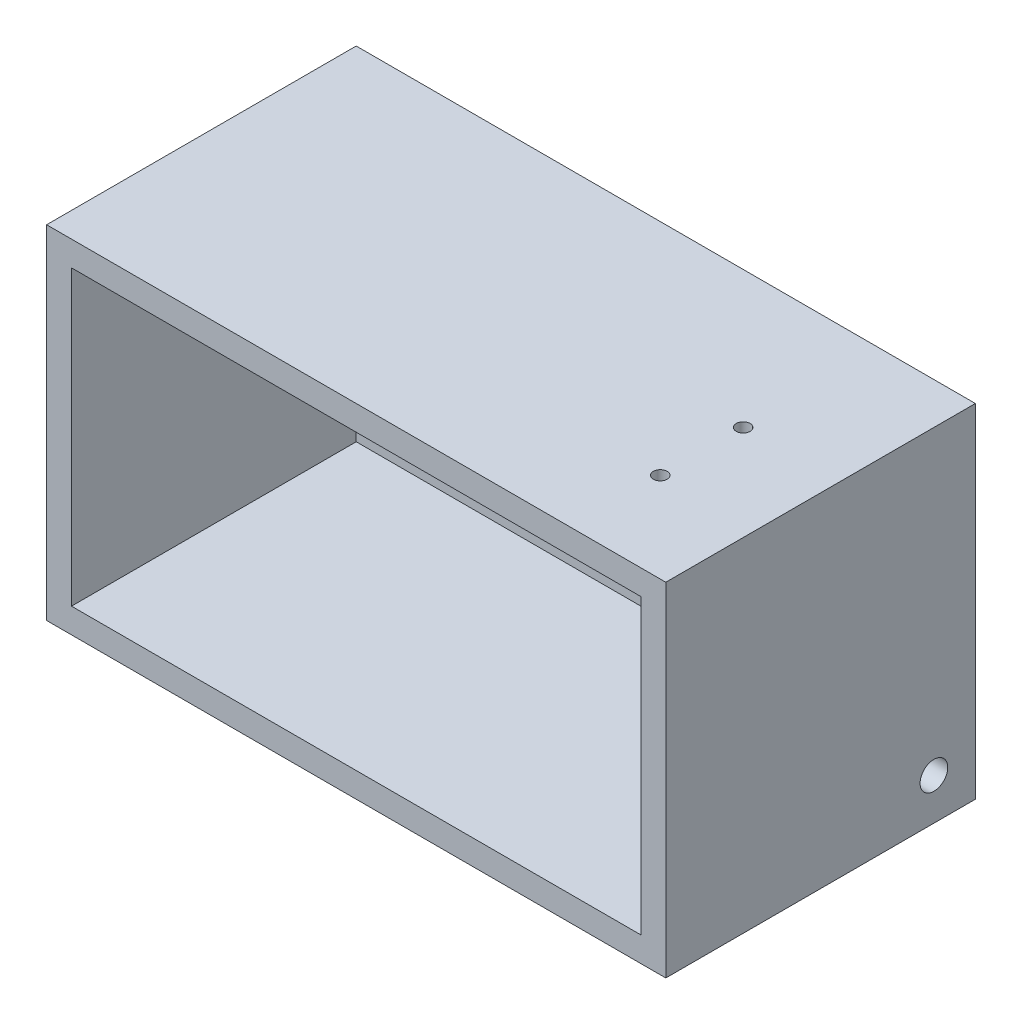
ISO-10303-21;
HEADER;
FILE_DESCRIPTION(('STEP AP214'),'2;1');
FILE_NAME('part.step','',(''),(''),'','','');
FILE_SCHEMA(('AUTOMOTIVE_DESIGN { 1 0 10303 214 1 1 1 1 }'));
ENDSEC;
DATA;
#1=APPLICATION_CONTEXT('core data for automotive mechanical design processes');
#2=APPLICATION_PROTOCOL_DEFINITION('international standard','automotive_design',2000,#1);
#3=PRODUCT_CONTEXT('',#1,'mechanical');
#4=PRODUCT('Part','Part','',(#3));
#5=PRODUCT_RELATED_PRODUCT_CATEGORY('part','',(#4));
#6=PRODUCT_DEFINITION_FORMATION('','',#4);
#7=PRODUCT_DEFINITION_CONTEXT('part definition',#1,'design');
#8=PRODUCT_DEFINITION('design','',#6,#7);
#9=PRODUCT_DEFINITION_SHAPE('','',#8);
#10=(LENGTH_UNIT() NAMED_UNIT(*) SI_UNIT(.MILLI.,.METRE.));
#11=(NAMED_UNIT(*) PLANE_ANGLE_UNIT() SI_UNIT($,.RADIAN.));
#12=(NAMED_UNIT(*) SI_UNIT($,.STERADIAN.) SOLID_ANGLE_UNIT());
#13=UNCERTAINTY_MEASURE_WITH_UNIT(LENGTH_MEASURE(1.E-05),#10,'distance_accuracy_value','');
#14=(GEOMETRIC_REPRESENTATION_CONTEXT(3) GLOBAL_UNCERTAINTY_ASSIGNED_CONTEXT((#13)) GLOBAL_UNIT_ASSIGNED_CONTEXT((#10,
#11,#12)) REPRESENTATION_CONTEXT('',''));
#15=CARTESIAN_POINT('',(0.,0.,0.));
#16=DIRECTION('',(0.,0.,1.));
#17=DIRECTION('',(1.,0.,0.));
#18=AXIS2_PLACEMENT_3D('',#15,#16,#17);
#19=CARTESIAN_POINT('',(0.,0.,112.));
#20=DIRECTION('',(1.,0.,0.));
#21=DIRECTION('',(0.,0.,-1.));
#22=AXIS2_PLACEMENT_3D('',#19,#20,#21);
#23=PLANE('',#22);
#24=DIRECTION('',(0.,-1.,0.));
#25=VECTOR('',#24,1.);
#26=CARTESIAN_POINT('',(0.,0.,-112.));
#27=LINE('',#26,#25);
#28=CARTESIAN_POINT('',(0.,248.,-112.));
#29=VERTEX_POINT('',#28);
#30=CARTESIAN_POINT('',(0.,0.,-112.));
#31=VERTEX_POINT('',#30);
#32=EDGE_CURVE('E147',#29,#31,#27,.T.);
#33=ORIENTED_EDGE('',*,*,#32,.T.);
#34=DIRECTION('',(0.,0.,-1.));
#35=VECTOR('',#34,1.);
#36=CARTESIAN_POINT('',(0.,0.,112.));
#37=LINE('',#36,#35);
#38=CARTESIAN_POINT('',(0.,0.,112.));
#39=VERTEX_POINT('',#38);
#40=EDGE_CURVE('E11',#39,#31,#37,.T.);
#41=ORIENTED_EDGE('',*,*,#40,.F.);
#42=DIRECTION('',(0.,-1.,0.));
#43=VECTOR('',#42,1.);
#44=CARTESIAN_POINT('',(0.,0.,112.));
#45=LINE('',#44,#43);
#46=CARTESIAN_POINT('',(0.,248.,112.));
#47=VERTEX_POINT('',#46);
#48=EDGE_CURVE('E151',#47,#39,#45,.T.);
#49=ORIENTED_EDGE('',*,*,#48,.F.);
#50=DIRECTION('',(0.,0.,-1.));
#51=VECTOR('',#50,1.);
#52=CARTESIAN_POINT('',(0.,248.,112.));
#53=LINE('',#52,#51);
#54=EDGE_CURVE('E157',#47,#29,#53,.T.);
#55=ORIENTED_EDGE('',*,*,#54,.T.);
#56=EDGE_LOOP('',(#33,#41,#49,#55));
#57=FACE_BOUND('',#56,.T.);
#58=ADVANCED_FACE('F36',(#57),#23,.F.);
#59=CARTESIAN_POINT('',(0.,0.,112.));
#60=DIRECTION('',(0.,1.,0.));
#61=DIRECTION('',(0.,0.,1.));
#62=AXIS2_PLACEMENT_3D('',#59,#60,#61);
#63=PLANE('',#62);
#64=DIRECTION('',(1.,0.,0.));
#65=VECTOR('',#64,1.);
#66=CARTESIAN_POINT('',(0.,0.,-112.));
#67=LINE('',#66,#65);
#68=CARTESIAN_POINT('',(448.,0.,-112.));
#69=VERTEX_POINT('',#68);
#70=EDGE_CURVE('E160',#31,#69,#67,.T.);
#71=ORIENTED_EDGE('',*,*,#70,.T.);
#72=DIRECTION('',(0.,0.,-1.));
#73=VECTOR('',#72,1.);
#74=CARTESIAN_POINT('',(448.,0.,112.));
#75=LINE('',#74,#73);
#76=CARTESIAN_POINT('',(448.,0.,112.));
#77=VERTEX_POINT('',#76);
#78=EDGE_CURVE('E43',#77,#69,#75,.T.);
#79=ORIENTED_EDGE('',*,*,#78,.F.);
#80=DIRECTION('',(1.,0.,0.));
#81=VECTOR('',#80,1.);
#82=CARTESIAN_POINT('',(0.,0.,112.));
#83=LINE('',#82,#81);
#84=EDGE_CURVE('E87',#39,#77,#83,.T.);
#85=ORIENTED_EDGE('',*,*,#84,.F.);
#86=ORIENTED_EDGE('',*,*,#40,.T.);
#87=EDGE_LOOP('',(#71,#79,#85,#86));
#88=FACE_BOUND('',#87,.T.);
#89=ADVANCED_FACE('F190',(#88),#63,.F.);
#90=CARTESIAN_POINT('',(448.,0.,112.));
#91=DIRECTION('',(-1.,0.,0.));
#92=DIRECTION('',(0.,0.,1.));
#93=AXIS2_PLACEMENT_3D('',#90,#91,#92);
#94=PLANE('',#93);
#95=CARTESIAN_POINT('',(448.,30.,-82.));
#96=DIRECTION('',(1.,0.,0.));
#97=DIRECTION('',(0.,0.,-1.));
#98=AXIS2_PLACEMENT_3D('',#95,#96,#97);
#99=CIRCLE('',#98,9.99999999999999);
#100=CARTESIAN_POINT('',(448.,30.,-92.));
#101=VERTEX_POINT('',#100);
#102=EDGE_CURVE('E135',#101,#101,#99,.T.);
#103=ORIENTED_EDGE('',*,*,#102,.F.);
#104=EDGE_LOOP('',(#103));
#105=FACE_BOUND('',#104,.T.);
#106=DIRECTION('',(0.,1.,0.));
#107=VECTOR('',#106,1.);
#108=CARTESIAN_POINT('',(448.,0.,-112.));
#109=LINE('',#108,#107);
#110=CARTESIAN_POINT('',(448.,248.,-112.));
#111=VERTEX_POINT('',#110);
#112=EDGE_CURVE('E162',#69,#111,#109,.T.);
#113=ORIENTED_EDGE('',*,*,#112,.T.);
#114=DIRECTION('',(0.,0.,-1.));
#115=VECTOR('',#114,1.);
#116=CARTESIAN_POINT('',(448.,248.,112.));
#117=LINE('',#116,#115);
#118=CARTESIAN_POINT('',(448.,248.,112.));
#119=VERTEX_POINT('',#118);
#120=EDGE_CURVE('E166',#119,#111,#117,.T.);
#121=ORIENTED_EDGE('',*,*,#120,.F.);
#122=DIRECTION('',(0.,1.,0.));
#123=VECTOR('',#122,1.);
#124=CARTESIAN_POINT('',(448.,0.,112.));
#125=LINE('',#124,#123);
#126=EDGE_CURVE('E154',#77,#119,#125,.T.);
#127=ORIENTED_EDGE('',*,*,#126,.F.);
#128=ORIENTED_EDGE('',*,*,#78,.T.);
#129=EDGE_LOOP('',(#113,#121,#127,#128));
#130=FACE_BOUND('',#129,.T.);
#131=ADVANCED_FACE('F171',(#105,#130),#94,.F.);
#132=CARTESIAN_POINT('',(0.,248.,112.));
#133=DIRECTION('',(0.,-1.,0.));
#134=DIRECTION('',(0.,0.,-1.));
#135=AXIS2_PLACEMENT_3D('',#132,#133,#134);
#136=PLANE('',#135);
#137=CARTESIAN_POINT('',(379.,248.,-13.));
#138=DIRECTION('',(0.,1.,0.));
#139=DIRECTION('',(0.,0.,1.));
#140=AXIS2_PLACEMENT_3D('',#137,#138,#139);
#141=CIRCLE('',#140,4.99999999999999);
#142=CARTESIAN_POINT('',(379.,248.,-8.00000000000001));
#143=VERTEX_POINT('',#142);
#144=EDGE_CURVE('E306',#143,#143,#141,.T.);
#145=ORIENTED_EDGE('',*,*,#144,.F.);
#146=EDGE_LOOP('',(#145));
#147=FACE_BOUND('',#146,.T.);
#148=CARTESIAN_POINT('',(379.000000000001,248.,47.));
#149=DIRECTION('',(0.,1.,0.));
#150=DIRECTION('',(0.,0.,1.));
#151=AXIS2_PLACEMENT_3D('',#148,#149,#150);
#152=CIRCLE('',#151,4.99999999999999);
#153=CARTESIAN_POINT('',(379.000000000001,248.,52.));
#154=VERTEX_POINT('',#153);
#155=EDGE_CURVE('E312',#154,#154,#152,.T.);
#156=ORIENTED_EDGE('',*,*,#155,.F.);
#157=EDGE_LOOP('',(#156));
#158=FACE_BOUND('',#157,.T.);
#159=DIRECTION('',(-1.,0.,0.));
#160=VECTOR('',#159,1.);
#161=CARTESIAN_POINT('',(0.,248.,-112.));
#162=LINE('',#161,#160);
#163=EDGE_CURVE('E80',#111,#29,#162,.T.);
#164=ORIENTED_EDGE('',*,*,#163,.T.);
#165=ORIENTED_EDGE('',*,*,#54,.F.);
#166=DIRECTION('',(-1.,0.,0.));
#167=VECTOR('',#166,1.);
#168=CARTESIAN_POINT('',(0.,248.,112.));
#169=LINE('',#168,#167);
#170=EDGE_CURVE('E59',#119,#47,#169,.T.);
#171=ORIENTED_EDGE('',*,*,#170,.F.);
#172=ORIENTED_EDGE('',*,*,#120,.T.);
#173=EDGE_LOOP('',(#164,#165,#171,#172));
#174=FACE_BOUND('',#173,.T.);
#175=ADVANCED_FACE('F179',(#147,#158,#174),#136,.F.);
#176=CARTESIAN_POINT('',(0.,0.,112.));
#177=DIRECTION('',(0.,0.,-1.));
#178=DIRECTION('',(-1.,0.,0.));
#179=AXIS2_PLACEMENT_3D('',#176,#177,#178);
#180=PLANE('',#179);
#181=DIRECTION('',(1.,0.,0.));
#182=VECTOR('',#181,1.);
#183=CARTESIAN_POINT('',(18.,18.,112.));
#184=LINE('',#183,#182);
#185=CARTESIAN_POINT('',(18.,18.,112.));
#186=VERTEX_POINT('',#185);
#187=CARTESIAN_POINT('',(430.,18.,112.));
#188=VERTEX_POINT('',#187);
#189=EDGE_CURVE('E141',#186,#188,#184,.T.);
#190=ORIENTED_EDGE('',*,*,#189,.F.);
#191=DIRECTION('',(0.,-1.,0.));
#192=VECTOR('',#191,1.);
#193=CARTESIAN_POINT('',(18.,230.,112.));
#194=LINE('',#193,#192);
#195=CARTESIAN_POINT('',(18.,230.,112.));
#196=VERTEX_POINT('',#195);
#197=EDGE_CURVE('E50',#196,#186,#194,.T.);
#198=ORIENTED_EDGE('',*,*,#197,.F.);
#199=DIRECTION('',(-1.,0.,0.));
#200=VECTOR('',#199,1.);
#201=CARTESIAN_POINT('',(18.,230.,112.));
#202=LINE('',#201,#200);
#203=CARTESIAN_POINT('',(430.,230.,112.));
#204=VERTEX_POINT('',#203);
#205=EDGE_CURVE('E129',#204,#196,#202,.T.);
#206=ORIENTED_EDGE('',*,*,#205,.F.);
#207=DIRECTION('',(0.,1.,0.));
#208=VECTOR('',#207,1.);
#209=CARTESIAN_POINT('',(430.,230.,112.));
#210=LINE('',#209,#208);
#211=EDGE_CURVE('E132',#188,#204,#210,.T.);
#212=ORIENTED_EDGE('',*,*,#211,.F.);
#213=EDGE_LOOP('',(#190,#198,#206,#212));
#214=FACE_BOUND('',#213,.T.);
#215=ORIENTED_EDGE('',*,*,#48,.T.);
#216=ORIENTED_EDGE('',*,*,#84,.T.);
#217=ORIENTED_EDGE('',*,*,#126,.T.);
#218=ORIENTED_EDGE('',*,*,#170,.T.);
#219=EDGE_LOOP('',(#215,#216,#217,#218));
#220=FACE_BOUND('',#219,.T.);
#221=ADVANCED_FACE('F181',(#214,#220),#180,.F.);
#222=CARTESIAN_POINT('',(0.,0.,-112.));
#223=DIRECTION('',(0.,0.,-1.));
#224=DIRECTION('',(-1.,0.,0.));
#225=AXIS2_PLACEMENT_3D('',#222,#223,#224);
#226=PLANE('',#225);
#227=ORIENTED_EDGE('',*,*,#32,.F.);
#228=ORIENTED_EDGE('',*,*,#163,.F.);
#229=ORIENTED_EDGE('',*,*,#112,.F.);
#230=ORIENTED_EDGE('',*,*,#70,.F.);
#231=EDGE_LOOP('',(#227,#228,#229,#230));
#232=FACE_BOUND('',#231,.T.);
#233=ADVANCED_FACE('F175',(#232),#226,.T.);
#234=CARTESIAN_POINT('',(18.,230.,-94.));
#235=DIRECTION('',(-1.,0.,0.));
#236=DIRECTION('',(0.,-1.,0.));
#237=AXIS2_PLACEMENT_3D('',#234,#235,#236);
#238=PLANE('',#237);
#239=ORIENTED_EDGE('',*,*,#197,.T.);
#240=DIRECTION('',(0.,0.,1.));
#241=VECTOR('',#240,1.);
#242=CARTESIAN_POINT('',(18.,18.,-94.));
#243=LINE('',#242,#241);
#244=CARTESIAN_POINT('',(18.,18.,-94.));
#245=VERTEX_POINT('',#244);
#246=EDGE_CURVE('E107',#245,#186,#243,.T.);
#247=ORIENTED_EDGE('',*,*,#246,.F.);
#248=DIRECTION('',(0.,-1.,0.));
#249=VECTOR('',#248,1.);
#250=CARTESIAN_POINT('',(18.,230.,-94.));
#251=LINE('',#250,#249);
#252=CARTESIAN_POINT('',(18.,230.,-94.));
#253=VERTEX_POINT('',#252);
#254=EDGE_CURVE('E111',#253,#245,#251,.T.);
#255=ORIENTED_EDGE('',*,*,#254,.F.);
#256=DIRECTION('',(0.,0.,1.));
#257=VECTOR('',#256,1.);
#258=CARTESIAN_POINT('',(18.,230.,-94.));
#259=LINE('',#258,#257);
#260=EDGE_CURVE('E145',#253,#196,#259,.T.);
#261=ORIENTED_EDGE('',*,*,#260,.T.);
#262=EDGE_LOOP('',(#239,#247,#255,#261));
#263=FACE_BOUND('',#262,.T.);
#264=ADVANCED_FACE('F109',(#263),#238,.F.);
#265=CARTESIAN_POINT('',(18.,230.,-94.));
#266=DIRECTION('',(0.,1.,0.));
#267=DIRECTION('',(0.,0.,1.));
#268=AXIS2_PLACEMENT_3D('',#265,#266,#267);
#269=PLANE('',#268);
#270=CARTESIAN_POINT('',(379.,230.,-13.));
#271=DIRECTION('',(0.,1.,0.));
#272=DIRECTION('',(0.,0.,1.));
#273=AXIS2_PLACEMENT_3D('',#270,#271,#272);
#274=CIRCLE('',#273,4.99999999999999);
#275=CARTESIAN_POINT('',(379.,230.,-8.00000000000001));
#276=VERTEX_POINT('',#275);
#277=EDGE_CURVE('E304',#276,#276,#274,.T.);
#278=ORIENTED_EDGE('',*,*,#277,.T.);
#279=EDGE_LOOP('',(#278));
#280=FACE_BOUND('',#279,.T.);
#281=CARTESIAN_POINT('',(379.000000000001,230.,47.));
#282=DIRECTION('',(0.,1.,0.));
#283=DIRECTION('',(0.,0.,1.));
#284=AXIS2_PLACEMENT_3D('',#281,#282,#283);
#285=CIRCLE('',#284,4.99999999999999);
#286=CARTESIAN_POINT('',(379.000000000001,230.,52.));
#287=VERTEX_POINT('',#286);
#288=EDGE_CURVE('E307',#287,#287,#285,.T.);
#289=ORIENTED_EDGE('',*,*,#288,.T.);
#290=EDGE_LOOP('',(#289));
#291=FACE_BOUND('',#290,.T.);
#292=ORIENTED_EDGE('',*,*,#205,.T.);
#293=ORIENTED_EDGE('',*,*,#260,.F.);
#294=DIRECTION('',(-1.,0.,0.));
#295=VECTOR('',#294,1.);
#296=CARTESIAN_POINT('',(18.,230.,-94.));
#297=LINE('',#296,#295);
#298=CARTESIAN_POINT('',(430.,230.,-94.));
#299=VERTEX_POINT('',#298);
#300=EDGE_CURVE('E117',#299,#253,#297,.T.);
#301=ORIENTED_EDGE('',*,*,#300,.F.);
#302=DIRECTION('',(0.,0.,1.));
#303=VECTOR('',#302,1.);
#304=CARTESIAN_POINT('',(430.,230.,-94.));
#305=LINE('',#304,#303);
#306=EDGE_CURVE('E148',#299,#204,#305,.T.);
#307=ORIENTED_EDGE('',*,*,#306,.T.);
#308=EDGE_LOOP('',(#292,#293,#301,#307));
#309=FACE_BOUND('',#308,.T.);
#310=ADVANCED_FACE('F223',(#280,#291,#309),#269,.F.);
#311=CARTESIAN_POINT('',(430.,230.,-94.));
#312=DIRECTION('',(1.,0.,0.));
#313=DIRECTION('',(0.,1.,0.));
#314=AXIS2_PLACEMENT_3D('',#311,#312,#313);
#315=PLANE('',#314);
#316=CARTESIAN_POINT('',(430.,30.,-82.));
#317=DIRECTION('',(1.,0.,0.));
#318=DIRECTION('',(0.,1.,0.));
#319=AXIS2_PLACEMENT_3D('',#316,#317,#318);
#320=CIRCLE('',#319,9.99999999999999);
#321=CARTESIAN_POINT('',(430.,40.,-82.));
#322=VERTEX_POINT('',#321);
#323=EDGE_CURVE('E309',#322,#322,#320,.F.);
#324=ORIENTED_EDGE('',*,*,#323,.F.);
#325=EDGE_LOOP('',(#324));
#326=FACE_BOUND('',#325,.T.);
#327=ORIENTED_EDGE('',*,*,#211,.T.);
#328=ORIENTED_EDGE('',*,*,#306,.F.);
#329=DIRECTION('',(0.,1.,0.));
#330=VECTOR('',#329,1.);
#331=CARTESIAN_POINT('',(430.,230.,-94.));
#332=LINE('',#331,#330);
#333=CARTESIAN_POINT('',(430.,18.,-94.));
#334=VERTEX_POINT('',#333);
#335=EDGE_CURVE('E125',#334,#299,#332,.T.);
#336=ORIENTED_EDGE('',*,*,#335,.F.);
#337=DIRECTION('',(0.,0.,1.));
#338=VECTOR('',#337,1.);
#339=CARTESIAN_POINT('',(430.,18.,-94.));
#340=LINE('',#339,#338);
#341=EDGE_CURVE('E116',#334,#188,#340,.T.);
#342=ORIENTED_EDGE('',*,*,#341,.T.);
#343=EDGE_LOOP('',(#327,#328,#336,#342));
#344=FACE_BOUND('',#343,.T.);
#345=ADVANCED_FACE('F218',(#326,#344),#315,.F.);
#346=CARTESIAN_POINT('',(18.,18.,-94.));
#347=DIRECTION('',(0.,-1.,0.));
#348=DIRECTION('',(0.,0.,-1.));
#349=AXIS2_PLACEMENT_3D('',#346,#347,#348);
#350=PLANE('',#349);
#351=ORIENTED_EDGE('',*,*,#189,.T.);
#352=ORIENTED_EDGE('',*,*,#341,.F.);
#353=DIRECTION('',(1.,0.,0.));
#354=VECTOR('',#353,1.);
#355=CARTESIAN_POINT('',(18.,18.,-94.));
#356=LINE('',#355,#354);
#357=EDGE_CURVE('E120',#245,#334,#356,.T.);
#358=ORIENTED_EDGE('',*,*,#357,.F.);
#359=ORIENTED_EDGE('',*,*,#246,.T.);
#360=EDGE_LOOP('',(#351,#352,#358,#359));
#361=FACE_BOUND('',#360,.T.);
#362=ADVANCED_FACE('F121',(#361),#350,.F.);
#363=CARTESIAN_POINT('',(0.,0.,-94.));
#364=DIRECTION('',(0.,0.,1.));
#365=DIRECTION('',(1.,0.,0.));
#366=AXIS2_PLACEMENT_3D('',#363,#364,#365);
#367=PLANE('',#366);
#368=ORIENTED_EDGE('',*,*,#254,.T.);
#369=ORIENTED_EDGE('',*,*,#357,.T.);
#370=ORIENTED_EDGE('',*,*,#335,.T.);
#371=ORIENTED_EDGE('',*,*,#300,.T.);
#372=EDGE_LOOP('',(#368,#369,#370,#371));
#373=FACE_BOUND('',#372,.T.);
#374=ADVANCED_FACE('F127',(#373),#367,.T.);
#375=CARTESIAN_POINT('',(-0.000999999999973245,30.,-82.));
#376=DIRECTION('',(1.,0.,0.));
#377=DIRECTION('',(0.,0.,-1.));
#378=AXIS2_PLACEMENT_3D('',#375,#376,#377);
#379=CYLINDRICAL_SURFACE('',#378,9.99999999999999);
#380=ORIENTED_EDGE('',*,*,#102,.T.);
#381=EDGE_LOOP('',(#380));
#382=FACE_BOUND('',#381,.T.);
#383=ORIENTED_EDGE('',*,*,#323,.T.);
#384=EDGE_LOOP('',(#383));
#385=FACE_BOUND('',#384,.T.);
#386=ADVANCED_FACE('F233',(#382,#385),#379,.F.);
#387=CARTESIAN_POINT('',(379.000000000001,230.,47.));
#388=DIRECTION('',(0.,1.,0.));
#389=DIRECTION('',(0.,0.,1.));
#390=AXIS2_PLACEMENT_3D('',#387,#388,#389);
#391=CYLINDRICAL_SURFACE('',#390,4.99999999999999);
#392=ORIENTED_EDGE('',*,*,#288,.F.);
#393=EDGE_LOOP('',(#392));
#394=FACE_BOUND('',#393,.T.);
#395=ORIENTED_EDGE('',*,*,#155,.T.);
#396=EDGE_LOOP('',(#395));
#397=FACE_BOUND('',#396,.T.);
#398=ADVANCED_FACE('F237',(#394,#397),#391,.F.);
#399=CARTESIAN_POINT('',(379.,230.,-13.));
#400=DIRECTION('',(0.,1.,0.));
#401=DIRECTION('',(0.,0.,1.));
#402=AXIS2_PLACEMENT_3D('',#399,#400,#401);
#403=CYLINDRICAL_SURFACE('',#402,4.99999999999999);
#404=ORIENTED_EDGE('',*,*,#277,.F.);
#405=EDGE_LOOP('',(#404));
#406=FACE_BOUND('',#405,.T.);
#407=ORIENTED_EDGE('',*,*,#144,.T.);
#408=EDGE_LOOP('',(#407));
#409=FACE_BOUND('',#408,.T.);
#410=ADVANCED_FACE('F261',(#406,#409),#403,.F.);
#411=CLOSED_SHELL('',(#58,#89,#131,#175,#221,#233,#264,#310,#345,#362,#374,#386,#398,#410));
#412=MANIFOLD_SOLID_BREP('B2',#411);
#413=ADVANCED_BREP_SHAPE_REPRESENTATION('',(#18,#412),#14);
#414=SHAPE_DEFINITION_REPRESENTATION(#9,#413);
ENDSEC;
END-ISO-10303-21;
